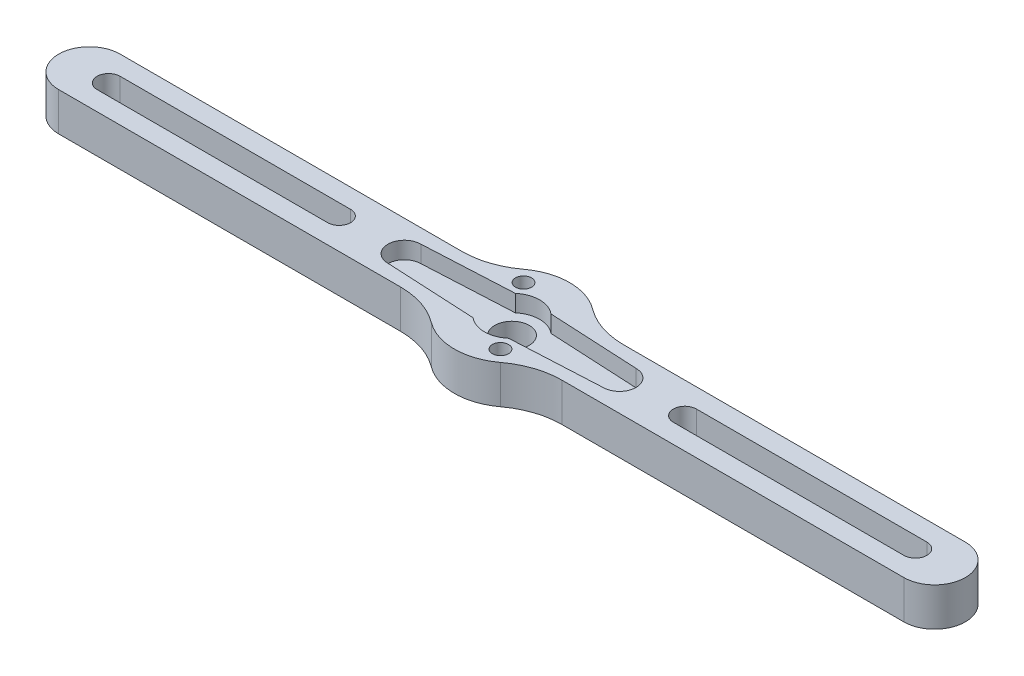
ISO-10303-21;
HEADER;
FILE_DESCRIPTION(('STEP AP214'),'2;1');
FILE_NAME('part.step','',(''),(''),'','','');
FILE_SCHEMA(('AUTOMOTIVE_DESIGN { 1 0 10303 214 1 1 1 1 }'));
ENDSEC;
DATA;
#1=APPLICATION_CONTEXT('core data for automotive mechanical design processes');
#2=APPLICATION_PROTOCOL_DEFINITION('international standard','automotive_design',2000,#1);
#3=PRODUCT_CONTEXT('',#1,'mechanical');
#4=PRODUCT('Part','Part','',(#3));
#5=PRODUCT_RELATED_PRODUCT_CATEGORY('part','',(#4));
#6=PRODUCT_DEFINITION_FORMATION('','',#4);
#7=PRODUCT_DEFINITION_CONTEXT('part definition',#1,'design');
#8=PRODUCT_DEFINITION('design','',#6,#7);
#9=PRODUCT_DEFINITION_SHAPE('','',#8);
#10=(LENGTH_UNIT() NAMED_UNIT(*) SI_UNIT(.MILLI.,.METRE.));
#11=(NAMED_UNIT(*) PLANE_ANGLE_UNIT() SI_UNIT($,.RADIAN.));
#12=(NAMED_UNIT(*) SI_UNIT($,.STERADIAN.) SOLID_ANGLE_UNIT());
#13=UNCERTAINTY_MEASURE_WITH_UNIT(LENGTH_MEASURE(1.E-05),#10,'distance_accuracy_value','');
#14=(GEOMETRIC_REPRESENTATION_CONTEXT(3) GLOBAL_UNCERTAINTY_ASSIGNED_CONTEXT((#13)) GLOBAL_UNIT_ASSIGNED_CONTEXT((#10,
#11,#12)) REPRESENTATION_CONTEXT('',''));
#15=CARTESIAN_POINT('',(0.,0.,0.));
#16=DIRECTION('',(0.,0.,1.));
#17=DIRECTION('',(1.,0.,0.));
#18=AXIS2_PLACEMENT_3D('',#15,#16,#17);
#19=CARTESIAN_POINT('',(0.,5.,0.));
#20=DIRECTION('',(0.,-1.,0.));
#21=DIRECTION('',(0.,0.,-1.));
#22=AXIS2_PLACEMENT_3D('',#19,#20,#21);
#23=CYLINDRICAL_SURFACE('',#22,2.25);
#24=CARTESIAN_POINT('',(0.,0.,0.));
#25=DIRECTION('',(0.,1.,0.));
#26=DIRECTION('',(0.,0.,1.));
#27=AXIS2_PLACEMENT_3D('',#24,#25,#26);
#28=CIRCLE('',#27,2.25);
#29=CARTESIAN_POINT('',(0.,0.,2.25));
#30=VERTEX_POINT('',#29);
#31=EDGE_CURVE('E358',#30,#30,#28,.T.);
#32=ORIENTED_EDGE('',*,*,#31,.F.);
#33=EDGE_LOOP('',(#32));
#34=FACE_BOUND('',#33,.T.);
#35=CARTESIAN_POINT('',(0.,2.8,0.));
#36=DIRECTION('',(0.,1.,0.));
#37=DIRECTION('',(0.,0.,1.));
#38=AXIS2_PLACEMENT_3D('',#35,#36,#37);
#39=CIRCLE('',#38,2.25);
#40=CARTESIAN_POINT('',(0.,2.8,2.25));
#41=VERTEX_POINT('',#40);
#42=EDGE_CURVE('E283',#41,#41,#39,.T.);
#43=ORIENTED_EDGE('',*,*,#42,.T.);
#44=EDGE_LOOP('',(#43));
#45=FACE_BOUND('',#44,.T.);
#46=ADVANCED_FACE('F37',(#34,#45),#23,.F.);
#47=CARTESIAN_POINT('',(0.,5.,-1.50000000000001));
#48=DIRECTION('',(0.,0.,-1.));
#49=DIRECTION('',(-1.,0.,0.));
#50=AXIS2_PLACEMENT_3D('',#47,#48,#49);
#51=PLANE('',#50);
#52=DIRECTION('',(1.,0.,0.));
#53=VECTOR('',#52,1.);
#54=CARTESIAN_POINT('',(0.,0.,-1.50000000000001));
#55=LINE('',#54,#53);
#56=CARTESIAN_POINT('',(22.5,0.,-1.50000000000001));
#57=VERTEX_POINT('',#56);
#58=CARTESIAN_POINT('',(52.5,0.,-1.50000000000001));
#59=VERTEX_POINT('',#58);
#60=EDGE_CURVE('E389',#57,#59,#55,.T.);
#61=ORIENTED_EDGE('',*,*,#60,.T.);
#62=DIRECTION('',(0.,-1.,0.));
#63=VECTOR('',#62,1.);
#64=CARTESIAN_POINT('',(52.5,5.,-1.50000000000001));
#65=LINE('',#64,#63);
#66=CARTESIAN_POINT('',(52.5,5.,-1.50000000000001));
#67=VERTEX_POINT('',#66);
#68=EDGE_CURVE('E407',#67,#59,#65,.T.);
#69=ORIENTED_EDGE('',*,*,#68,.F.);
#70=DIRECTION('',(1.,0.,0.));
#71=VECTOR('',#70,1.);
#72=CARTESIAN_POINT('',(0.,5.,-1.50000000000001));
#73=LINE('',#72,#71);
#74=CARTESIAN_POINT('',(22.5,5.,-1.50000000000001));
#75=VERTEX_POINT('',#74);
#76=EDGE_CURVE('E335',#75,#67,#73,.T.);
#77=ORIENTED_EDGE('',*,*,#76,.F.);
#78=DIRECTION('',(0.,-1.,0.));
#79=VECTOR('',#78,1.);
#80=CARTESIAN_POINT('',(22.5,5.,-1.50000000000001));
#81=LINE('',#80,#79);
#82=EDGE_CURVE('E399',#75,#57,#81,.T.);
#83=ORIENTED_EDGE('',*,*,#82,.T.);
#84=EDGE_LOOP('',(#61,#69,#77,#83));
#85=FACE_BOUND('',#84,.T.);
#86=ADVANCED_FACE('F517',(#85),#51,.F.);
#87=CARTESIAN_POINT('',(52.5,5.,0.));
#88=DIRECTION('',(0.,-1.,0.));
#89=DIRECTION('',(0.,0.,-1.));
#90=AXIS2_PLACEMENT_3D('',#87,#88,#89);
#91=CYLINDRICAL_SURFACE('',#90,1.50000000000001);
#92=CARTESIAN_POINT('',(52.5,0.,0.));
#93=DIRECTION('',(0.,1.,0.));
#94=DIRECTION('',(0.,0.,1.));
#95=AXIS2_PLACEMENT_3D('',#92,#93,#94);
#96=CIRCLE('',#95,1.50000000000001);
#97=CARTESIAN_POINT('',(52.5,0.,1.50000000000001));
#98=VERTEX_POINT('',#97);
#99=EDGE_CURVE('E392',#59,#98,#96,.F.);
#100=ORIENTED_EDGE('',*,*,#99,.T.);
#101=DIRECTION('',(0.,-1.,0.));
#102=VECTOR('',#101,1.);
#103=CARTESIAN_POINT('',(52.5,5.,1.50000000000001));
#104=LINE('',#103,#102);
#105=CARTESIAN_POINT('',(52.5,5.,1.50000000000001));
#106=VERTEX_POINT('',#105);
#107=EDGE_CURVE('E405',#106,#98,#104,.T.);
#108=ORIENTED_EDGE('',*,*,#107,.F.);
#109=CARTESIAN_POINT('',(52.5,5.,0.));
#110=DIRECTION('',(0.,1.,0.));
#111=DIRECTION('',(0.,0.,1.));
#112=AXIS2_PLACEMENT_3D('',#109,#110,#111);
#113=CIRCLE('',#112,1.50000000000001);
#114=EDGE_CURVE('E338',#67,#106,#113,.F.);
#115=ORIENTED_EDGE('',*,*,#114,.F.);
#116=ORIENTED_EDGE('',*,*,#68,.T.);
#117=EDGE_LOOP('',(#100,#108,#115,#116));
#118=FACE_BOUND('',#117,.T.);
#119=ADVANCED_FACE('F523',(#118),#91,.F.);
#120=CARTESIAN_POINT('',(0.,5.,1.50000000000001));
#121=DIRECTION('',(0.,0.,-1.));
#122=DIRECTION('',(-1.,0.,0.));
#123=AXIS2_PLACEMENT_3D('',#120,#121,#122);
#124=PLANE('',#123);
#125=DIRECTION('',(1.,0.,0.));
#126=VECTOR('',#125,1.);
#127=CARTESIAN_POINT('',(0.,0.,1.50000000000001));
#128=LINE('',#127,#126);
#129=CARTESIAN_POINT('',(22.5,0.,1.50000000000001));
#130=VERTEX_POINT('',#129);
#131=EDGE_CURVE('E395',#130,#98,#128,.T.);
#132=ORIENTED_EDGE('',*,*,#131,.F.);
#133=DIRECTION('',(0.,-1.,0.));
#134=VECTOR('',#133,1.);
#135=CARTESIAN_POINT('',(22.5,5.,1.50000000000001));
#136=LINE('',#135,#134);
#137=CARTESIAN_POINT('',(22.5,5.,1.50000000000001));
#138=VERTEX_POINT('',#137);
#139=EDGE_CURVE('E402',#138,#130,#136,.T.);
#140=ORIENTED_EDGE('',*,*,#139,.F.);
#141=DIRECTION('',(1.,0.,0.));
#142=VECTOR('',#141,1.);
#143=CARTESIAN_POINT('',(0.,5.,1.50000000000001));
#144=LINE('',#143,#142);
#145=EDGE_CURVE('E340',#138,#106,#144,.T.);
#146=ORIENTED_EDGE('',*,*,#145,.T.);
#147=ORIENTED_EDGE('',*,*,#107,.T.);
#148=EDGE_LOOP('',(#132,#140,#146,#147));
#149=FACE_BOUND('',#148,.T.);
#150=ADVANCED_FACE('F596',(#149),#124,.T.);
#151=CARTESIAN_POINT('',(55.,5.,0.));
#152=DIRECTION('',(0.,-1.,0.));
#153=DIRECTION('',(0.,0.,-1.));
#154=AXIS2_PLACEMENT_3D('',#151,#152,#153);
#155=CYLINDRICAL_SURFACE('',#154,3.99999999999998);
#156=CARTESIAN_POINT('',(55.,0.,0.));
#157=DIRECTION('',(0.,1.,0.));
#158=DIRECTION('',(0.,0.,1.));
#159=AXIS2_PLACEMENT_3D('',#156,#157,#158);
#160=CIRCLE('',#159,3.99999999999998);
#161=CARTESIAN_POINT('',(55.,0.,-3.99999999999998));
#162=VERTEX_POINT('',#161);
#163=CARTESIAN_POINT('',(55.,0.,3.99999999999998));
#164=VERTEX_POINT('',#163);
#165=EDGE_CURVE('E367',#162,#164,#160,.F.);
#166=ORIENTED_EDGE('',*,*,#165,.F.);
#167=DIRECTION('',(0.,-1.,0.));
#168=VECTOR('',#167,1.);
#169=CARTESIAN_POINT('',(55.,5.,-3.99999999999998));
#170=LINE('',#169,#168);
#171=CARTESIAN_POINT('',(55.,5.,-3.99999999999998));
#172=VERTEX_POINT('',#171);
#173=EDGE_CURVE('E403',#172,#162,#170,.T.);
#174=ORIENTED_EDGE('',*,*,#173,.F.);
#175=CARTESIAN_POINT('',(55.,5.,0.));
#176=DIRECTION('',(0.,1.,0.));
#177=DIRECTION('',(0.,0.,1.));
#178=AXIS2_PLACEMENT_3D('',#175,#176,#177);
#179=CIRCLE('',#178,3.99999999999998);
#180=CARTESIAN_POINT('',(55.,5.,3.99999999999998));
#181=VERTEX_POINT('',#180);
#182=EDGE_CURVE('E313',#172,#181,#179,.F.);
#183=ORIENTED_EDGE('',*,*,#182,.T.);
#184=DIRECTION('',(0.,-1.,0.));
#185=VECTOR('',#184,1.);
#186=CARTESIAN_POINT('',(55.,5.,3.99999999999998));
#187=LINE('',#186,#185);
#188=EDGE_CURVE('E411',#181,#164,#187,.T.);
#189=ORIENTED_EDGE('',*,*,#188,.T.);
#190=EDGE_LOOP('',(#166,#174,#183,#189));
#191=FACE_BOUND('',#190,.T.);
#192=ADVANCED_FACE('F503',(#191),#155,.T.);
#193=CARTESIAN_POINT('',(0.,5.,-4.));
#194=DIRECTION('',(0.,0.,-1.));
#195=DIRECTION('',(-1.,0.,0.));
#196=AXIS2_PLACEMENT_3D('',#193,#194,#195);
#197=PLANE('',#196);
#198=DIRECTION('',(1.,0.,0.));
#199=VECTOR('',#198,1.);
#200=CARTESIAN_POINT('',(0.,0.,-4.));
#201=LINE('',#200,#199);
#202=CARTESIAN_POINT('',(10.5,0.,-4.));
#203=VERTEX_POINT('',#202);
#204=EDGE_CURVE('E370',#203,#162,#201,.T.);
#205=ORIENTED_EDGE('',*,*,#204,.F.);
#206=DIRECTION('',(0.,1.,0.));
#207=VECTOR('',#206,1.);
#208=CARTESIAN_POINT('',(10.5,5.,-4.));
#209=LINE('',#208,#207);
#210=CARTESIAN_POINT('',(10.5,5.,-4.));
#211=VERTEX_POINT('',#210);
#212=EDGE_CURVE('E444',#203,#211,#209,.T.);
#213=ORIENTED_EDGE('',*,*,#212,.T.);
#214=DIRECTION('',(1.,0.,0.));
#215=VECTOR('',#214,1.);
#216=CARTESIAN_POINT('',(0.,5.,-4.));
#217=LINE('',#216,#215);
#218=EDGE_CURVE('E316',#211,#172,#217,.T.);
#219=ORIENTED_EDGE('',*,*,#218,.T.);
#220=ORIENTED_EDGE('',*,*,#173,.T.);
#221=EDGE_LOOP('',(#205,#213,#219,#220));
#222=FACE_BOUND('',#221,.T.);
#223=ADVANCED_FACE('F506',(#222),#197,.T.);
#224=CARTESIAN_POINT('',(0.,5.,0.));
#225=DIRECTION('',(0.,-1.,0.));
#226=DIRECTION('',(0.,0.,-1.));
#227=AXIS2_PLACEMENT_3D('',#224,#225,#226);
#228=CYLINDRICAL_SURFACE('',#227,7.5);
#229=CARTESIAN_POINT('',(0.,5.,0.));
#230=DIRECTION('',(0.,1.,0.));
#231=DIRECTION('',(0.,0.,1.));
#232=AXIS2_PLACEMENT_3D('',#229,#230,#231);
#233=CIRCLE('',#232,7.5);
#234=CARTESIAN_POINT('',(-4.5,5.,-6.));
#235=VERTEX_POINT('',#234);
#236=CARTESIAN_POINT('',(4.5,5.,-6.));
#237=VERTEX_POINT('',#236);
#238=EDGE_CURVE('E318',#235,#237,#233,.F.);
#239=ORIENTED_EDGE('',*,*,#238,.T.);
#240=DIRECTION('',(0.,-1.,0.));
#241=VECTOR('',#240,1.);
#242=CARTESIAN_POINT('',(4.5,5.,-6.));
#243=LINE('',#242,#241);
#244=CARTESIAN_POINT('',(4.5,0.,-6.));
#245=VERTEX_POINT('',#244);
#246=EDGE_CURVE('E441',#237,#245,#243,.T.);
#247=ORIENTED_EDGE('',*,*,#246,.T.);
#248=CARTESIAN_POINT('',(0.,0.,0.));
#249=DIRECTION('',(0.,1.,0.));
#250=DIRECTION('',(0.,0.,1.));
#251=AXIS2_PLACEMENT_3D('',#248,#249,#250);
#252=CIRCLE('',#251,7.5);
#253=CARTESIAN_POINT('',(-4.5,0.,-6.));
#254=VERTEX_POINT('',#253);
#255=EDGE_CURVE('E372',#254,#245,#252,.F.);
#256=ORIENTED_EDGE('',*,*,#255,.F.);
#257=DIRECTION('',(0.,-1.,0.));
#258=VECTOR('',#257,1.);
#259=CARTESIAN_POINT('',(-4.5,5.,-6.));
#260=LINE('',#259,#258);
#261=EDGE_CURVE('E439',#254,#235,#260,.F.);
#262=ORIENTED_EDGE('',*,*,#261,.T.);
#263=EDGE_LOOP('',(#239,#247,#256,#262));
#264=FACE_BOUND('',#263,.T.);
#265=ADVANCED_FACE('F466',(#264),#228,.T.);
#266=CARTESIAN_POINT('',(0.,5.,-4.));
#267=DIRECTION('',(0.,0.,1.));
#268=DIRECTION('',(1.,0.,0.));
#269=AXIS2_PLACEMENT_3D('',#266,#267,#268);
#270=PLANE('',#269);
#271=DIRECTION('',(-1.,0.,0.));
#272=VECTOR('',#271,1.);
#273=CARTESIAN_POINT('',(0.,5.,-4.));
#274=LINE('',#273,#272);
#275=CARTESIAN_POINT('',(-10.5,5.,-4.));
#276=VERTEX_POINT('',#275);
#277=CARTESIAN_POINT('',(-55.,5.,-3.99999999999999));
#278=VERTEX_POINT('',#277);
#279=EDGE_CURVE('E321',#276,#278,#274,.T.);
#280=ORIENTED_EDGE('',*,*,#279,.F.);
#281=DIRECTION('',(0.,-1.,0.));
#282=VECTOR('',#281,1.);
#283=CARTESIAN_POINT('',(-10.5,5.,-4.));
#284=LINE('',#283,#282);
#285=CARTESIAN_POINT('',(-10.5,0.,-4.));
#286=VERTEX_POINT('',#285);
#287=EDGE_CURVE('E446',#276,#286,#284,.T.);
#288=ORIENTED_EDGE('',*,*,#287,.T.);
#289=DIRECTION('',(-1.,0.,0.));
#290=VECTOR('',#289,1.);
#291=CARTESIAN_POINT('',(0.,0.,-4.));
#292=LINE('',#291,#290);
#293=CARTESIAN_POINT('',(-55.,0.,-3.99999999999999));
#294=VERTEX_POINT('',#293);
#295=EDGE_CURVE('E375',#286,#294,#292,.T.);
#296=ORIENTED_EDGE('',*,*,#295,.T.);
#297=DIRECTION('',(0.,-1.,0.));
#298=VECTOR('',#297,1.);
#299=CARTESIAN_POINT('',(-55.,5.,-3.99999999999999));
#300=LINE('',#299,#298);
#301=EDGE_CURVE('E417',#278,#294,#300,.T.);
#302=ORIENTED_EDGE('',*,*,#301,.F.);
#303=EDGE_LOOP('',(#280,#288,#296,#302));
#304=FACE_BOUND('',#303,.T.);
#305=ADVANCED_FACE('F469',(#304),#270,.F.);
#306=CARTESIAN_POINT('',(-55.,5.,0.));
#307=DIRECTION('',(0.,-1.,0.));
#308=DIRECTION('',(0.,0.,-1.));
#309=AXIS2_PLACEMENT_3D('',#306,#307,#308);
#310=CYLINDRICAL_SURFACE('',#309,3.99999999999999);
#311=CARTESIAN_POINT('',(-55.,0.,0.));
#312=DIRECTION('',(0.,1.,0.));
#313=DIRECTION('',(0.,0.,1.));
#314=AXIS2_PLACEMENT_3D('',#311,#312,#313);
#315=CIRCLE('',#314,3.99999999999999);
#316=CARTESIAN_POINT('',(-55.,0.,3.99999999999999));
#317=VERTEX_POINT('',#316);
#318=EDGE_CURVE('E377',#294,#317,#315,.T.);
#319=ORIENTED_EDGE('',*,*,#318,.T.);
#320=DIRECTION('',(0.,-1.,0.));
#321=VECTOR('',#320,1.);
#322=CARTESIAN_POINT('',(-55.,5.,3.99999999999999));
#323=LINE('',#322,#321);
#324=CARTESIAN_POINT('',(-55.,5.,3.99999999999999));
#325=VERTEX_POINT('',#324);
#326=EDGE_CURVE('E413',#325,#317,#323,.T.);
#327=ORIENTED_EDGE('',*,*,#326,.F.);
#328=CARTESIAN_POINT('',(-55.,5.,0.));
#329=DIRECTION('',(0.,1.,0.));
#330=DIRECTION('',(0.,0.,1.));
#331=AXIS2_PLACEMENT_3D('',#328,#329,#330);
#332=CIRCLE('',#331,3.99999999999999);
#333=EDGE_CURVE('E323',#278,#325,#332,.T.);
#334=ORIENTED_EDGE('',*,*,#333,.F.);
#335=ORIENTED_EDGE('',*,*,#301,.T.);
#336=EDGE_LOOP('',(#319,#327,#334,#335));
#337=FACE_BOUND('',#336,.T.);
#338=ADVANCED_FACE('F477',(#337),#310,.T.);
#339=CARTESIAN_POINT('',(0.,5.,4.));
#340=DIRECTION('',(0.,0.,-1.));
#341=DIRECTION('',(-1.,0.,0.));
#342=AXIS2_PLACEMENT_3D('',#339,#340,#341);
#343=PLANE('',#342);
#344=DIRECTION('',(1.,0.,0.));
#345=VECTOR('',#344,1.);
#346=CARTESIAN_POINT('',(0.,0.,4.));
#347=LINE('',#346,#345);
#348=CARTESIAN_POINT('',(-10.5,0.,4.));
#349=VERTEX_POINT('',#348);
#350=EDGE_CURVE('E380',#317,#349,#347,.T.);
#351=ORIENTED_EDGE('',*,*,#350,.T.);
#352=DIRECTION('',(0.,1.,0.));
#353=VECTOR('',#352,1.);
#354=CARTESIAN_POINT('',(-10.5,5.,4.));
#355=LINE('',#354,#353);
#356=CARTESIAN_POINT('',(-10.5,5.,4.));
#357=VERTEX_POINT('',#356);
#358=EDGE_CURVE('E437',#349,#357,#355,.T.);
#359=ORIENTED_EDGE('',*,*,#358,.T.);
#360=DIRECTION('',(1.,0.,0.));
#361=VECTOR('',#360,1.);
#362=CARTESIAN_POINT('',(0.,5.,4.));
#363=LINE('',#362,#361);
#364=EDGE_CURVE('E326',#325,#357,#363,.T.);
#365=ORIENTED_EDGE('',*,*,#364,.F.);
#366=ORIENTED_EDGE('',*,*,#326,.T.);
#367=EDGE_LOOP('',(#351,#359,#365,#366));
#368=FACE_BOUND('',#367,.T.);
#369=ADVANCED_FACE('F479',(#368),#343,.F.);
#370=CARTESIAN_POINT('',(0.,5.,0.));
#371=DIRECTION('',(0.,-1.,0.));
#372=DIRECTION('',(0.,0.,-1.));
#373=AXIS2_PLACEMENT_3D('',#370,#371,#372);
#374=CYLINDRICAL_SURFACE('',#373,7.5);
#375=CARTESIAN_POINT('',(0.,0.,0.));
#376=DIRECTION('',(0.,1.,0.));
#377=DIRECTION('',(0.,0.,1.));
#378=AXIS2_PLACEMENT_3D('',#375,#376,#377);
#379=CIRCLE('',#378,7.5);
#380=CARTESIAN_POINT('',(-4.5,0.,6.));
#381=VERTEX_POINT('',#380);
#382=CARTESIAN_POINT('',(4.5,0.,6.));
#383=VERTEX_POINT('',#382);
#384=EDGE_CURVE('E383',#381,#383,#379,.T.);
#385=ORIENTED_EDGE('',*,*,#384,.T.);
#386=DIRECTION('',(0.,-1.,0.));
#387=VECTOR('',#386,1.);
#388=CARTESIAN_POINT('',(4.5,5.,6.));
#389=LINE('',#388,#387);
#390=CARTESIAN_POINT('',(4.5,5.,6.));
#391=VERTEX_POINT('',#390);
#392=EDGE_CURVE('E435',#383,#391,#389,.F.);
#393=ORIENTED_EDGE('',*,*,#392,.T.);
#394=CARTESIAN_POINT('',(0.,5.,0.));
#395=DIRECTION('',(0.,1.,0.));
#396=DIRECTION('',(0.,0.,1.));
#397=AXIS2_PLACEMENT_3D('',#394,#395,#396);
#398=CIRCLE('',#397,7.5);
#399=CARTESIAN_POINT('',(-4.5,5.,6.));
#400=VERTEX_POINT('',#399);
#401=EDGE_CURVE('E329',#400,#391,#398,.T.);
#402=ORIENTED_EDGE('',*,*,#401,.F.);
#403=DIRECTION('',(0.,-1.,0.));
#404=VECTOR('',#403,1.);
#405=CARTESIAN_POINT('',(-4.5,5.,6.));
#406=LINE('',#405,#404);
#407=EDGE_CURVE('E432',#400,#381,#406,.T.);
#408=ORIENTED_EDGE('',*,*,#407,.T.);
#409=EDGE_LOOP('',(#385,#393,#402,#408));
#410=FACE_BOUND('',#409,.T.);
#411=ADVANCED_FACE('F488',(#410),#374,.T.);
#412=CARTESIAN_POINT('',(-52.5,5.,0.));
#413=DIRECTION('',(0.,-1.,0.));
#414=DIRECTION('',(0.,0.,-1.));
#415=AXIS2_PLACEMENT_3D('',#412,#413,#414);
#416=CYLINDRICAL_SURFACE('',#415,1.50000000000001);
#417=CARTESIAN_POINT('',(-52.5,0.,0.));
#418=DIRECTION('',(0.,1.,0.));
#419=DIRECTION('',(0.,0.,1.));
#420=AXIS2_PLACEMENT_3D('',#417,#418,#419);
#421=CIRCLE('',#420,1.50000000000001);
#422=CARTESIAN_POINT('',(-52.5,0.,-1.5));
#423=VERTEX_POINT('',#422);
#424=CARTESIAN_POINT('',(-52.5,0.,1.50000000000002));
#425=VERTEX_POINT('',#424);
#426=EDGE_CURVE('E346',#423,#425,#421,.T.);
#427=ORIENTED_EDGE('',*,*,#426,.F.);
#428=DIRECTION('',(0.,-1.,0.));
#429=VECTOR('',#428,1.);
#430=CARTESIAN_POINT('',(-52.5,5.,-1.5));
#431=LINE('',#430,#429);
#432=CARTESIAN_POINT('',(-52.5,5.,-1.5));
#433=VERTEX_POINT('',#432);
#434=EDGE_CURVE('E414',#433,#423,#431,.T.);
#435=ORIENTED_EDGE('',*,*,#434,.F.);
#436=CARTESIAN_POINT('',(-52.5,5.,0.));
#437=DIRECTION('',(0.,1.,0.));
#438=DIRECTION('',(0.,0.,1.));
#439=AXIS2_PLACEMENT_3D('',#436,#437,#438);
#440=CIRCLE('',#439,1.50000000000001);
#441=CARTESIAN_POINT('',(-52.5,5.,1.50000000000002));
#442=VERTEX_POINT('',#441);
#443=EDGE_CURVE('E295',#433,#442,#440,.T.);
#444=ORIENTED_EDGE('',*,*,#443,.T.);
#445=DIRECTION('',(0.,-1.,0.));
#446=VECTOR('',#445,1.);
#447=CARTESIAN_POINT('',(-52.5,5.,1.50000000000002));
#448=LINE('',#447,#446);
#449=EDGE_CURVE('E345',#442,#425,#448,.T.);
#450=ORIENTED_EDGE('',*,*,#449,.T.);
#451=EDGE_LOOP('',(#427,#435,#444,#450));
#452=FACE_BOUND('',#451,.T.);
#453=ADVANCED_FACE('F544',(#452),#416,.F.);
#454=CARTESIAN_POINT('',(0.,5.,-1.50000000000001));
#455=DIRECTION('',(0.,0.,1.));
#456=DIRECTION('',(1.,0.,0.));
#457=AXIS2_PLACEMENT_3D('',#454,#455,#456);
#458=PLANE('',#457);
#459=DIRECTION('',(-1.,0.,0.));
#460=VECTOR('',#459,1.);
#461=CARTESIAN_POINT('',(0.,0.,-1.50000000000001));
#462=LINE('',#461,#460);
#463=CARTESIAN_POINT('',(-22.5,0.,-1.50000000000001));
#464=VERTEX_POINT('',#463);
#465=EDGE_CURVE('E349',#464,#423,#462,.T.);
#466=ORIENTED_EDGE('',*,*,#465,.F.);
#467=DIRECTION('',(0.,-1.,0.));
#468=VECTOR('',#467,1.);
#469=CARTESIAN_POINT('',(-22.5,5.,-1.50000000000001));
#470=LINE('',#469,#468);
#471=CARTESIAN_POINT('',(-22.5,5.,-1.50000000000001));
#472=VERTEX_POINT('',#471);
#473=EDGE_CURVE('E425',#472,#464,#470,.T.);
#474=ORIENTED_EDGE('',*,*,#473,.F.);
#475=DIRECTION('',(-1.,0.,0.));
#476=VECTOR('',#475,1.);
#477=CARTESIAN_POINT('',(0.,5.,-1.50000000000001));
#478=LINE('',#477,#476);
#479=EDGE_CURVE('E298',#472,#433,#478,.T.);
#480=ORIENTED_EDGE('',*,*,#479,.T.);
#481=ORIENTED_EDGE('',*,*,#434,.T.);
#482=EDGE_LOOP('',(#466,#474,#480,#481));
#483=FACE_BOUND('',#482,.T.);
#484=ADVANCED_FACE('F540',(#483),#458,.T.);
#485=CARTESIAN_POINT('',(-22.5,5.,0.));
#486=DIRECTION('',(0.,-1.,0.));
#487=DIRECTION('',(0.,0.,-1.));
#488=AXIS2_PLACEMENT_3D('',#485,#486,#487);
#489=CYLINDRICAL_SURFACE('',#488,1.50000000000001);
#490=CARTESIAN_POINT('',(-22.5,0.,0.));
#491=DIRECTION('',(0.,1.,0.));
#492=DIRECTION('',(0.,0.,1.));
#493=AXIS2_PLACEMENT_3D('',#490,#491,#492);
#494=CIRCLE('',#493,1.50000000000001);
#495=CARTESIAN_POINT('',(-22.5,0.,1.50000000000002));
#496=VERTEX_POINT('',#495);
#497=EDGE_CURVE('E352',#496,#464,#494,.T.);
#498=ORIENTED_EDGE('',*,*,#497,.F.);
#499=DIRECTION('',(0.,-1.,0.));
#500=VECTOR('',#499,1.);
#501=CARTESIAN_POINT('',(-22.5,5.,1.50000000000002));
#502=LINE('',#501,#500);
#503=CARTESIAN_POINT('',(-22.5,5.,1.50000000000002));
#504=VERTEX_POINT('',#503);
#505=EDGE_CURVE('E423',#504,#496,#502,.T.);
#506=ORIENTED_EDGE('',*,*,#505,.F.);
#507=CARTESIAN_POINT('',(-22.5,5.,0.));
#508=DIRECTION('',(0.,1.,0.));
#509=DIRECTION('',(0.,0.,1.));
#510=AXIS2_PLACEMENT_3D('',#507,#508,#509);
#511=CIRCLE('',#510,1.50000000000001);
#512=EDGE_CURVE('E302',#504,#472,#511,.T.);
#513=ORIENTED_EDGE('',*,*,#512,.T.);
#514=ORIENTED_EDGE('',*,*,#473,.T.);
#515=EDGE_LOOP('',(#498,#506,#513,#514));
#516=FACE_BOUND('',#515,.T.);
#517=ADVANCED_FACE('F537',(#516),#489,.F.);
#518=CARTESIAN_POINT('',(0.,5.,4.));
#519=DIRECTION('',(0.,0.,1.));
#520=DIRECTION('',(1.,0.,0.));
#521=AXIS2_PLACEMENT_3D('',#518,#519,#520);
#522=PLANE('',#521);
#523=DIRECTION('',(-1.,0.,0.));
#524=VECTOR('',#523,1.);
#525=CARTESIAN_POINT('',(0.,5.,4.));
#526=LINE('',#525,#524);
#527=CARTESIAN_POINT('',(10.5,5.,4.));
#528=VERTEX_POINT('',#527);
#529=EDGE_CURVE('E332',#181,#528,#526,.T.);
#530=ORIENTED_EDGE('',*,*,#529,.T.);
#531=DIRECTION('',(0.,-1.,0.));
#532=VECTOR('',#531,1.);
#533=CARTESIAN_POINT('',(10.5,5.,4.));
#534=LINE('',#533,#532);
#535=CARTESIAN_POINT('',(10.5,0.,4.));
#536=VERTEX_POINT('',#535);
#537=EDGE_CURVE('E410',#528,#536,#534,.T.);
#538=ORIENTED_EDGE('',*,*,#537,.T.);
#539=DIRECTION('',(-1.,0.,0.));
#540=VECTOR('',#539,1.);
#541=CARTESIAN_POINT('',(0.,0.,4.));
#542=LINE('',#541,#540);
#543=EDGE_CURVE('E386',#164,#536,#542,.T.);
#544=ORIENTED_EDGE('',*,*,#543,.F.);
#545=ORIENTED_EDGE('',*,*,#188,.F.);
#546=EDGE_LOOP('',(#530,#538,#544,#545));
#547=FACE_BOUND('',#546,.T.);
#548=ADVANCED_FACE('F496',(#547),#522,.T.);
#549=CARTESIAN_POINT('',(-3.,5.,-4.5));
#550=DIRECTION('',(0.,-1.,0.));
#551=DIRECTION('',(0.,0.,-1.));
#552=AXIS2_PLACEMENT_3D('',#549,#550,#551);
#553=CYLINDRICAL_SURFACE('',#552,1.05);
#554=CARTESIAN_POINT('',(-3.,5.,-4.5));
#555=DIRECTION('',(0.,1.,0.));
#556=DIRECTION('',(0.,0.,1.));
#557=AXIS2_PLACEMENT_3D('',#554,#555,#556);
#558=CIRCLE('',#557,1.05);
#559=CARTESIAN_POINT('',(-3.,5.,-3.45));
#560=VERTEX_POINT('',#559);
#561=EDGE_CURVE('E310',#560,#560,#558,.T.);
#562=ORIENTED_EDGE('',*,*,#561,.T.);
#563=EDGE_LOOP('',(#562));
#564=FACE_BOUND('',#563,.T.);
#565=CARTESIAN_POINT('',(-3.,0.,-4.5));
#566=DIRECTION('',(0.,1.,0.));
#567=DIRECTION('',(0.,0.,1.));
#568=AXIS2_PLACEMENT_3D('',#565,#566,#567);
#569=CIRCLE('',#568,1.05);
#570=CARTESIAN_POINT('',(-3.,0.,-3.45));
#571=VERTEX_POINT('',#570);
#572=EDGE_CURVE('E364',#571,#571,#569,.T.);
#573=ORIENTED_EDGE('',*,*,#572,.F.);
#574=EDGE_LOOP('',(#573));
#575=FACE_BOUND('',#574,.T.);
#576=ADVANCED_FACE('F605',(#564,#575),#553,.F.);
#577=CARTESIAN_POINT('',(3.,5.,4.5));
#578=DIRECTION('',(0.,-1.,0.));
#579=DIRECTION('',(0.,0.,-1.));
#580=AXIS2_PLACEMENT_3D('',#577,#578,#579);
#581=CYLINDRICAL_SURFACE('',#580,1.05);
#582=CARTESIAN_POINT('',(3.,5.,4.5));
#583=DIRECTION('',(0.,1.,0.));
#584=DIRECTION('',(0.,0.,1.));
#585=AXIS2_PLACEMENT_3D('',#582,#583,#584);
#586=CIRCLE('',#585,1.05);
#587=CARTESIAN_POINT('',(3.,5.,5.55));
#588=VERTEX_POINT('',#587);
#589=EDGE_CURVE('E307',#588,#588,#586,.T.);
#590=ORIENTED_EDGE('',*,*,#589,.T.);
#591=EDGE_LOOP('',(#590));
#592=FACE_BOUND('',#591,.T.);
#593=CARTESIAN_POINT('',(3.,0.,4.5));
#594=DIRECTION('',(0.,1.,0.));
#595=DIRECTION('',(0.,0.,1.));
#596=AXIS2_PLACEMENT_3D('',#593,#594,#595);
#597=CIRCLE('',#596,1.05);
#598=CARTESIAN_POINT('',(3.,0.,5.55));
#599=VERTEX_POINT('',#598);
#600=EDGE_CURVE('E361',#599,#599,#597,.T.);
#601=ORIENTED_EDGE('',*,*,#600,.F.);
#602=EDGE_LOOP('',(#601));
#603=FACE_BOUND('',#602,.T.);
#604=ADVANCED_FACE('F530',(#592,#603),#581,.F.);
#605=CARTESIAN_POINT('',(0.,5.,1.50000000000001));
#606=DIRECTION('',(0.,0.,1.));
#607=DIRECTION('',(1.,0.,0.));
#608=AXIS2_PLACEMENT_3D('',#605,#606,#607);
#609=PLANE('',#608);
#610=DIRECTION('',(-1.,0.,0.));
#611=VECTOR('',#610,1.);
#612=CARTESIAN_POINT('',(0.,0.,1.50000000000001));
#613=LINE('',#612,#611);
#614=EDGE_CURVE('E355',#496,#425,#613,.T.);
#615=ORIENTED_EDGE('',*,*,#614,.T.);
#616=ORIENTED_EDGE('',*,*,#449,.F.);
#617=DIRECTION('',(-1.,0.,0.));
#618=VECTOR('',#617,1.);
#619=CARTESIAN_POINT('',(0.,5.,1.50000000000001));
#620=LINE('',#619,#618);
#621=EDGE_CURVE('E305',#504,#442,#620,.T.);
#622=ORIENTED_EDGE('',*,*,#621,.F.);
#623=ORIENTED_EDGE('',*,*,#505,.T.);
#624=EDGE_LOOP('',(#615,#616,#622,#623));
#625=FACE_BOUND('',#624,.T.);
#626=ADVANCED_FACE('F532',(#625),#609,.F.);
#627=CARTESIAN_POINT('',(22.5,5.,0.));
#628=DIRECTION('',(0.,-1.,0.));
#629=DIRECTION('',(0.,0.,-1.));
#630=AXIS2_PLACEMENT_3D('',#627,#628,#629);
#631=CYLINDRICAL_SURFACE('',#630,1.50000000000001);
#632=CARTESIAN_POINT('',(22.5,0.,0.));
#633=DIRECTION('',(0.,1.,0.));
#634=DIRECTION('',(0.,0.,1.));
#635=AXIS2_PLACEMENT_3D('',#632,#633,#634);
#636=CIRCLE('',#635,1.50000000000001);
#637=EDGE_CURVE('E299',#130,#57,#636,.F.);
#638=ORIENTED_EDGE('',*,*,#637,.T.);
#639=ORIENTED_EDGE('',*,*,#82,.F.);
#640=CARTESIAN_POINT('',(22.5,5.,0.));
#641=DIRECTION('',(0.,1.,0.));
#642=DIRECTION('',(0.,0.,1.));
#643=AXIS2_PLACEMENT_3D('',#640,#641,#642);
#644=CIRCLE('',#643,1.50000000000001);
#645=EDGE_CURVE('E343',#138,#75,#644,.F.);
#646=ORIENTED_EDGE('',*,*,#645,.F.);
#647=ORIENTED_EDGE('',*,*,#139,.T.);
#648=EDGE_LOOP('',(#638,#639,#646,#647));
#649=FACE_BOUND('',#648,.T.);
#650=ADVANCED_FACE('F535',(#649),#631,.F.);
#651=CARTESIAN_POINT('',(0.,5.,0.));
#652=DIRECTION('',(0.,1.,0.));
#653=DIRECTION('',(0.,0.,1.));
#654=AXIS2_PLACEMENT_3D('',#651,#652,#653);
#655=PLANE('',#654);
#656=DIRECTION('',(-0.998682442068856,0.,-0.0513164681499629));
#657=VECTOR('',#656,1.);
#658=CARTESIAN_POINT('',(14.,5.,-2.15));
#659=LINE('',#658,#657);
#660=CARTESIAN_POINT('',(14.,5.,-2.15));
#661=VERTEX_POINT('',#660);
#662=CARTESIAN_POINT('',(2.32325203109779,5.,-2.75));
#663=VERTEX_POINT('',#662);
#664=EDGE_CURVE('E227',#661,#663,#659,.T.);
#665=ORIENTED_EDGE('',*,*,#664,.F.);
#666=CARTESIAN_POINT('',(14.,5.,0.));
#667=DIRECTION('',(0.,-1.,0.));
#668=DIRECTION('',(0.,0.,-1.));
#669=AXIS2_PLACEMENT_3D('',#666,#667,#668);
#670=CIRCLE('',#669,2.15);
#671=CARTESIAN_POINT('',(14.,5.,2.15));
#672=VERTEX_POINT('',#671);
#673=EDGE_CURVE('E245',#661,#672,#670,.T.);
#674=ORIENTED_EDGE('',*,*,#673,.T.);
#675=DIRECTION('',(-0.998682442068856,0.,0.0513164681499627));
#676=VECTOR('',#675,1.);
#677=CARTESIAN_POINT('',(14.,5.,2.15));
#678=LINE('',#677,#676);
#679=CARTESIAN_POINT('',(2.32325203109779,5.,2.75));
#680=VERTEX_POINT('',#679);
#681=EDGE_CURVE('E248',#672,#680,#678,.T.);
#682=ORIENTED_EDGE('',*,*,#681,.T.);
#683=CARTESIAN_POINT('',(0.,5.,0.));
#684=DIRECTION('',(0.,1.,0.));
#685=DIRECTION('',(0.,0.,1.));
#686=AXIS2_PLACEMENT_3D('',#683,#684,#685);
#687=CIRCLE('',#686,3.6);
#688=CARTESIAN_POINT('',(-2.32325203109779,5.,2.75));
#689=VERTEX_POINT('',#688);
#690=EDGE_CURVE('E276',#689,#680,#687,.T.);
#691=ORIENTED_EDGE('',*,*,#690,.F.);
#692=DIRECTION('',(0.998682442068856,0.,0.0513164681499627));
#693=VECTOR('',#692,1.);
#694=CARTESIAN_POINT('',(-14.,5.,2.15));
#695=LINE('',#694,#693);
#696=CARTESIAN_POINT('',(-14.,5.,2.15));
#697=VERTEX_POINT('',#696);
#698=EDGE_CURVE('E273',#697,#689,#695,.T.);
#699=ORIENTED_EDGE('',*,*,#698,.F.);
#700=CARTESIAN_POINT('',(-14.,5.,0.));
#701=DIRECTION('',(0.,1.,0.));
#702=DIRECTION('',(0.,0.,1.));
#703=AXIS2_PLACEMENT_3D('',#700,#701,#702);
#704=CIRCLE('',#703,2.15);
#705=CARTESIAN_POINT('',(-14.,5.,-2.15));
#706=VERTEX_POINT('',#705);
#707=EDGE_CURVE('E270',#706,#697,#704,.T.);
#708=ORIENTED_EDGE('',*,*,#707,.F.);
#709=DIRECTION('',(0.998682442068856,0.,-0.0513164681499629));
#710=VECTOR('',#709,1.);
#711=CARTESIAN_POINT('',(-14.,5.,-2.15));
#712=LINE('',#711,#710);
#713=CARTESIAN_POINT('',(-2.32325203109779,5.,-2.75));
#714=VERTEX_POINT('',#713);
#715=EDGE_CURVE('E267',#706,#714,#712,.T.);
#716=ORIENTED_EDGE('',*,*,#715,.T.);
#717=CARTESIAN_POINT('',(0.,5.,0.));
#718=DIRECTION('',(0.,1.,0.));
#719=DIRECTION('',(0.,0.,1.));
#720=AXIS2_PLACEMENT_3D('',#717,#718,#719);
#721=CIRCLE('',#720,3.6);
#722=EDGE_CURVE('E265',#663,#714,#721,.T.);
#723=ORIENTED_EDGE('',*,*,#722,.F.);
#724=EDGE_LOOP('',(#665,#674,#682,#691,#699,#708,#716,#723));
#725=FACE_BOUND('',#724,.T.);
#726=ORIENTED_EDGE('',*,*,#443,.F.);
#727=ORIENTED_EDGE('',*,*,#479,.F.);
#728=ORIENTED_EDGE('',*,*,#512,.F.);
#729=ORIENTED_EDGE('',*,*,#621,.T.);
#730=EDGE_LOOP('',(#726,#727,#728,#729));
#731=FACE_BOUND('',#730,.T.);
#732=ORIENTED_EDGE('',*,*,#589,.F.);
#733=EDGE_LOOP('',(#732));
#734=FACE_BOUND('',#733,.T.);
#735=ORIENTED_EDGE('',*,*,#561,.F.);
#736=EDGE_LOOP('',(#735));
#737=FACE_BOUND('',#736,.T.);
#738=ORIENTED_EDGE('',*,*,#182,.F.);
#739=ORIENTED_EDGE('',*,*,#218,.F.);
#740=CARTESIAN_POINT('',(10.5,5.,-14.));
#741=DIRECTION('',(0.,1.,0.));
#742=DIRECTION('',(0.,0.,1.));
#743=AXIS2_PLACEMENT_3D('',#740,#741,#742);
#744=CIRCLE('',#743,10.);
#745=EDGE_CURVE('E458',#211,#237,#744,.F.);
#746=ORIENTED_EDGE('',*,*,#745,.T.);
#747=ORIENTED_EDGE('',*,*,#238,.F.);
#748=CARTESIAN_POINT('',(-10.5,5.,-14.));
#749=DIRECTION('',(0.,1.,0.));
#750=DIRECTION('',(0.,0.,1.));
#751=AXIS2_PLACEMENT_3D('',#748,#749,#750);
#752=CIRCLE('',#751,10.);
#753=EDGE_CURVE('E11',#235,#276,#752,.F.);
#754=ORIENTED_EDGE('',*,*,#753,.T.);
#755=ORIENTED_EDGE('',*,*,#279,.T.);
#756=ORIENTED_EDGE('',*,*,#333,.T.);
#757=ORIENTED_EDGE('',*,*,#364,.T.);
#758=CARTESIAN_POINT('',(-10.5,5.,14.));
#759=DIRECTION('',(0.,1.,0.));
#760=DIRECTION('',(0.,0.,1.));
#761=AXIS2_PLACEMENT_3D('',#758,#759,#760);
#762=CIRCLE('',#761,10.);
#763=EDGE_CURVE('E454',#357,#400,#762,.F.);
#764=ORIENTED_EDGE('',*,*,#763,.T.);
#765=ORIENTED_EDGE('',*,*,#401,.T.);
#766=CARTESIAN_POINT('',(10.5,5.,14.));
#767=DIRECTION('',(0.,1.,0.));
#768=DIRECTION('',(0.,0.,1.));
#769=AXIS2_PLACEMENT_3D('',#766,#767,#768);
#770=CIRCLE('',#769,10.);
#771=EDGE_CURVE('E450',#391,#528,#770,.F.);
#772=ORIENTED_EDGE('',*,*,#771,.T.);
#773=ORIENTED_EDGE('',*,*,#529,.F.);
#774=EDGE_LOOP('',(#738,#739,#746,#747,#754,#755,#756,#757,#764,#765,#772,#773));
#775=FACE_BOUND('',#774,.T.);
#776=ORIENTED_EDGE('',*,*,#76,.T.);
#777=ORIENTED_EDGE('',*,*,#114,.T.);
#778=ORIENTED_EDGE('',*,*,#145,.F.);
#779=ORIENTED_EDGE('',*,*,#645,.T.);
#780=EDGE_LOOP('',(#776,#777,#778,#779));
#781=FACE_BOUND('',#780,.T.);
#782=ADVANCED_FACE('F473',(#725,#731,#734,#737,#775,#781),#655,.T.);
#783=CARTESIAN_POINT('',(0.,0.,0.));
#784=DIRECTION('',(0.,1.,0.));
#785=DIRECTION('',(0.,0.,1.));
#786=AXIS2_PLACEMENT_3D('',#783,#784,#785);
#787=PLANE('',#786);
#788=ORIENTED_EDGE('',*,*,#426,.T.);
#789=ORIENTED_EDGE('',*,*,#614,.F.);
#790=ORIENTED_EDGE('',*,*,#497,.T.);
#791=ORIENTED_EDGE('',*,*,#465,.T.);
#792=EDGE_LOOP('',(#788,#789,#790,#791));
#793=FACE_BOUND('',#792,.T.);
#794=ORIENTED_EDGE('',*,*,#31,.T.);
#795=EDGE_LOOP('',(#794));
#796=FACE_BOUND('',#795,.T.);
#797=ORIENTED_EDGE('',*,*,#600,.T.);
#798=EDGE_LOOP('',(#797));
#799=FACE_BOUND('',#798,.T.);
#800=ORIENTED_EDGE('',*,*,#572,.T.);
#801=EDGE_LOOP('',(#800));
#802=FACE_BOUND('',#801,.T.);
#803=ORIENTED_EDGE('',*,*,#165,.T.);
#804=ORIENTED_EDGE('',*,*,#543,.T.);
#805=CARTESIAN_POINT('',(10.5,0.,14.));
#806=DIRECTION('',(0.,1.,0.));
#807=DIRECTION('',(0.,0.,1.));
#808=AXIS2_PLACEMENT_3D('',#805,#806,#807);
#809=CIRCLE('',#808,10.);
#810=EDGE_CURVE('E448',#536,#383,#809,.T.);
#811=ORIENTED_EDGE('',*,*,#810,.T.);
#812=ORIENTED_EDGE('',*,*,#384,.F.);
#813=CARTESIAN_POINT('',(-10.5,0.,14.));
#814=DIRECTION('',(0.,1.,0.));
#815=DIRECTION('',(0.,0.,1.));
#816=AXIS2_PLACEMENT_3D('',#813,#814,#815);
#817=CIRCLE('',#816,10.);
#818=EDGE_CURVE('E452',#381,#349,#817,.T.);
#819=ORIENTED_EDGE('',*,*,#818,.T.);
#820=ORIENTED_EDGE('',*,*,#350,.F.);
#821=ORIENTED_EDGE('',*,*,#318,.F.);
#822=ORIENTED_EDGE('',*,*,#295,.F.);
#823=CARTESIAN_POINT('',(-10.5,0.,-14.));
#824=DIRECTION('',(0.,1.,0.));
#825=DIRECTION('',(0.,0.,1.));
#826=AXIS2_PLACEMENT_3D('',#823,#824,#825);
#827=CIRCLE('',#826,10.);
#828=EDGE_CURVE('E45',#286,#254,#827,.T.);
#829=ORIENTED_EDGE('',*,*,#828,.T.);
#830=ORIENTED_EDGE('',*,*,#255,.T.);
#831=CARTESIAN_POINT('',(10.5,0.,-14.));
#832=DIRECTION('',(0.,1.,0.));
#833=DIRECTION('',(0.,0.,1.));
#834=AXIS2_PLACEMENT_3D('',#831,#832,#833);
#835=CIRCLE('',#834,10.);
#836=EDGE_CURVE('E456',#245,#203,#835,.T.);
#837=ORIENTED_EDGE('',*,*,#836,.T.);
#838=ORIENTED_EDGE('',*,*,#204,.T.);
#839=EDGE_LOOP('',(#803,#804,#811,#812,#819,#820,#821,#822,#829,#830,#837,#838));
#840=FACE_BOUND('',#839,.T.);
#841=ORIENTED_EDGE('',*,*,#60,.F.);
#842=ORIENTED_EDGE('',*,*,#637,.F.);
#843=ORIENTED_EDGE('',*,*,#131,.T.);
#844=ORIENTED_EDGE('',*,*,#99,.F.);
#845=EDGE_LOOP('',(#841,#842,#843,#844));
#846=FACE_BOUND('',#845,.T.);
#847=ADVANCED_FACE('F462',(#793,#796,#799,#802,#840,#846),#787,.F.);
#848=CARTESIAN_POINT('',(14.,2.8,-2.15));
#849=DIRECTION('',(0.0513164681499629,0.,-0.998682442068856));
#850=DIRECTION('',(-0.998682442068856,0.,-0.0513164681499629));
#851=AXIS2_PLACEMENT_3D('',#848,#849,#850);
#852=PLANE('',#851);
#853=ORIENTED_EDGE('',*,*,#664,.T.);
#854=DIRECTION('',(0.,1.,0.));
#855=VECTOR('',#854,1.);
#856=CARTESIAN_POINT('',(2.32325203109779,2.8,-2.75));
#857=LINE('',#856,#855);
#858=CARTESIAN_POINT('',(2.32325203109779,2.8,-2.75));
#859=VERTEX_POINT('',#858);
#860=EDGE_CURVE('E221',#859,#663,#857,.T.);
#861=ORIENTED_EDGE('',*,*,#860,.F.);
#862=DIRECTION('',(-0.998682442068856,0.,-0.0513164681499629));
#863=VECTOR('',#862,1.);
#864=CARTESIAN_POINT('',(14.,2.8,-2.15));
#865=LINE('',#864,#863);
#866=CARTESIAN_POINT('',(14.,2.8,-2.15));
#867=VERTEX_POINT('',#866);
#868=EDGE_CURVE('E225',#867,#859,#865,.T.);
#869=ORIENTED_EDGE('',*,*,#868,.F.);
#870=DIRECTION('',(0.,1.,0.));
#871=VECTOR('',#870,1.);
#872=CARTESIAN_POINT('',(14.,2.8,-2.15));
#873=LINE('',#872,#871);
#874=EDGE_CURVE('E281',#867,#661,#873,.T.);
#875=ORIENTED_EDGE('',*,*,#874,.T.);
#876=EDGE_LOOP('',(#853,#861,#869,#875));
#877=FACE_BOUND('',#876,.T.);
#878=ADVANCED_FACE('F223',(#877),#852,.F.);
#879=CARTESIAN_POINT('',(14.,2.8,0.));
#880=DIRECTION('',(0.,1.,0.));
#881=DIRECTION('',(0.,0.,1.));
#882=AXIS2_PLACEMENT_3D('',#879,#880,#881);
#883=CYLINDRICAL_SURFACE('',#882,2.15);
#884=ORIENTED_EDGE('',*,*,#673,.F.);
#885=ORIENTED_EDGE('',*,*,#874,.F.);
#886=CARTESIAN_POINT('',(14.,2.8,0.));
#887=DIRECTION('',(0.,-1.,0.));
#888=DIRECTION('',(0.,0.,-1.));
#889=AXIS2_PLACEMENT_3D('',#886,#887,#888);
#890=CIRCLE('',#889,2.15);
#891=CARTESIAN_POINT('',(14.,2.8,2.15));
#892=VERTEX_POINT('',#891);
#893=EDGE_CURVE('E232',#867,#892,#890,.T.);
#894=ORIENTED_EDGE('',*,*,#893,.T.);
#895=DIRECTION('',(0.,1.,0.));
#896=VECTOR('',#895,1.);
#897=CARTESIAN_POINT('',(14.,2.8,2.15));
#898=LINE('',#897,#896);
#899=EDGE_CURVE('E284',#892,#672,#898,.T.);
#900=ORIENTED_EDGE('',*,*,#899,.T.);
#901=EDGE_LOOP('',(#884,#885,#894,#900));
#902=FACE_BOUND('',#901,.T.);
#903=ADVANCED_FACE('F562',(#902),#883,.F.);
#904=CARTESIAN_POINT('',(14.,2.8,2.15));
#905=DIRECTION('',(-0.0513164681499627,0.,-0.998682442068856));
#906=DIRECTION('',(-0.998682442068856,0.,0.0513164681499627));
#907=AXIS2_PLACEMENT_3D('',#904,#905,#906);
#908=PLANE('',#907);
#909=ORIENTED_EDGE('',*,*,#681,.F.);
#910=ORIENTED_EDGE('',*,*,#899,.F.);
#911=DIRECTION('',(-0.998682442068856,0.,0.0513164681499627));
#912=VECTOR('',#911,1.);
#913=CARTESIAN_POINT('',(14.,2.8,2.15));
#914=LINE('',#913,#912);
#915=CARTESIAN_POINT('',(2.32325203109779,2.8,2.75));
#916=VERTEX_POINT('',#915);
#917=EDGE_CURVE('E261',#892,#916,#914,.T.);
#918=ORIENTED_EDGE('',*,*,#917,.T.);
#919=DIRECTION('',(0.,1.,0.));
#920=VECTOR('',#919,1.);
#921=CARTESIAN_POINT('',(2.32325203109779,2.8,2.75));
#922=LINE('',#921,#920);
#923=EDGE_CURVE('E286',#916,#680,#922,.T.);
#924=ORIENTED_EDGE('',*,*,#923,.T.);
#925=EDGE_LOOP('',(#909,#910,#918,#924));
#926=FACE_BOUND('',#925,.T.);
#927=ADVANCED_FACE('F565',(#926),#908,.T.);
#928=CARTESIAN_POINT('',(0.,2.8,0.));
#929=DIRECTION('',(0.,1.,0.));
#930=DIRECTION('',(0.,0.,1.));
#931=AXIS2_PLACEMENT_3D('',#928,#929,#930);
#932=CYLINDRICAL_SURFACE('',#931,3.6);
#933=ORIENTED_EDGE('',*,*,#690,.T.);
#934=ORIENTED_EDGE('',*,*,#923,.F.);
#935=CARTESIAN_POINT('',(0.,2.8,0.));
#936=DIRECTION('',(0.,1.,0.));
#937=DIRECTION('',(0.,0.,1.));
#938=AXIS2_PLACEMENT_3D('',#935,#936,#937);
#939=CIRCLE('',#938,3.6);
#940=CARTESIAN_POINT('',(-2.32325203109779,2.8,2.75));
#941=VERTEX_POINT('',#940);
#942=EDGE_CURVE('E258',#941,#916,#939,.T.);
#943=ORIENTED_EDGE('',*,*,#942,.F.);
#944=DIRECTION('',(0.,1.,0.));
#945=VECTOR('',#944,1.);
#946=CARTESIAN_POINT('',(-2.32325203109779,2.8,2.75));
#947=LINE('',#946,#945);
#948=EDGE_CURVE('E288',#941,#689,#947,.T.);
#949=ORIENTED_EDGE('',*,*,#948,.T.);
#950=EDGE_LOOP('',(#933,#934,#943,#949));
#951=FACE_BOUND('',#950,.T.);
#952=ADVANCED_FACE('F569',(#951),#932,.F.);
#953=CARTESIAN_POINT('',(-14.,2.8,2.15));
#954=DIRECTION('',(-0.0513164681499627,0.,0.998682442068856));
#955=DIRECTION('',(0.998682442068856,0.,0.0513164681499627));
#956=AXIS2_PLACEMENT_3D('',#953,#954,#955);
#957=PLANE('',#956);
#958=ORIENTED_EDGE('',*,*,#698,.T.);
#959=ORIENTED_EDGE('',*,*,#948,.F.);
#960=DIRECTION('',(0.998682442068856,0.,0.0513164681499627));
#961=VECTOR('',#960,1.);
#962=CARTESIAN_POINT('',(-14.,2.8,2.15));
#963=LINE('',#962,#961);
#964=CARTESIAN_POINT('',(-14.,2.8,2.15));
#965=VERTEX_POINT('',#964);
#966=EDGE_CURVE('E255',#965,#941,#963,.T.);
#967=ORIENTED_EDGE('',*,*,#966,.F.);
#968=DIRECTION('',(0.,1.,0.));
#969=VECTOR('',#968,1.);
#970=CARTESIAN_POINT('',(-14.,2.8,2.15));
#971=LINE('',#970,#969);
#972=EDGE_CURVE('E290',#965,#697,#971,.T.);
#973=ORIENTED_EDGE('',*,*,#972,.T.);
#974=EDGE_LOOP('',(#958,#959,#967,#973));
#975=FACE_BOUND('',#974,.T.);
#976=ADVANCED_FACE('F573',(#975),#957,.F.);
#977=CARTESIAN_POINT('',(-14.,2.8,0.));
#978=DIRECTION('',(0.,1.,0.));
#979=DIRECTION('',(0.,0.,1.));
#980=AXIS2_PLACEMENT_3D('',#977,#978,#979);
#981=CYLINDRICAL_SURFACE('',#980,2.15);
#982=ORIENTED_EDGE('',*,*,#707,.T.);
#983=ORIENTED_EDGE('',*,*,#972,.F.);
#984=CARTESIAN_POINT('',(-14.,2.8,0.));
#985=DIRECTION('',(0.,1.,0.));
#986=DIRECTION('',(0.,0.,1.));
#987=AXIS2_PLACEMENT_3D('',#984,#985,#986);
#988=CIRCLE('',#987,2.15);
#989=CARTESIAN_POINT('',(-14.,2.8,-2.15));
#990=VERTEX_POINT('',#989);
#991=EDGE_CURVE('E252',#990,#965,#988,.T.);
#992=ORIENTED_EDGE('',*,*,#991,.F.);
#993=DIRECTION('',(0.,1.,0.));
#994=VECTOR('',#993,1.);
#995=CARTESIAN_POINT('',(-14.,2.8,-2.15));
#996=LINE('',#995,#994);
#997=EDGE_CURVE('E292',#990,#706,#996,.T.);
#998=ORIENTED_EDGE('',*,*,#997,.T.);
#999=EDGE_LOOP('',(#982,#983,#992,#998));
#1000=FACE_BOUND('',#999,.T.);
#1001=ADVANCED_FACE('F577',(#1000),#981,.F.);
#1002=CARTESIAN_POINT('',(-14.,2.8,-2.15));
#1003=DIRECTION('',(0.0513164681499629,0.,0.998682442068856));
#1004=DIRECTION('',(0.998682442068856,0.,-0.0513164681499629));
#1005=AXIS2_PLACEMENT_3D('',#1002,#1003,#1004);
#1006=PLANE('',#1005);
#1007=ORIENTED_EDGE('',*,*,#715,.F.);
#1008=ORIENTED_EDGE('',*,*,#997,.F.);
#1009=DIRECTION('',(0.998682442068856,0.,-0.0513164681499629));
#1010=VECTOR('',#1009,1.);
#1011=CARTESIAN_POINT('',(-14.,2.8,-2.15));
#1012=LINE('',#1011,#1010);
#1013=CARTESIAN_POINT('',(-2.32325203109779,2.8,-2.75));
#1014=VERTEX_POINT('',#1013);
#1015=EDGE_CURVE('E240',#990,#1014,#1012,.T.);
#1016=ORIENTED_EDGE('',*,*,#1015,.T.);
#1017=DIRECTION('',(0.,1.,0.));
#1018=VECTOR('',#1017,1.);
#1019=CARTESIAN_POINT('',(-2.32325203109779,2.8,-2.75));
#1020=LINE('',#1019,#1018);
#1021=EDGE_CURVE('E231',#1014,#714,#1020,.T.);
#1022=ORIENTED_EDGE('',*,*,#1021,.T.);
#1023=EDGE_LOOP('',(#1007,#1008,#1016,#1022));
#1024=FACE_BOUND('',#1023,.T.);
#1025=ADVANCED_FACE('F558',(#1024),#1006,.T.);
#1026=CARTESIAN_POINT('',(0.,2.8,0.));
#1027=DIRECTION('',(0.,1.,0.));
#1028=DIRECTION('',(0.,0.,1.));
#1029=AXIS2_PLACEMENT_3D('',#1026,#1027,#1028);
#1030=CYLINDRICAL_SURFACE('',#1029,3.6);
#1031=ORIENTED_EDGE('',*,*,#722,.T.);
#1032=ORIENTED_EDGE('',*,*,#1021,.F.);
#1033=CARTESIAN_POINT('',(0.,2.8,0.));
#1034=DIRECTION('',(0.,1.,0.));
#1035=DIRECTION('',(0.,0.,1.));
#1036=AXIS2_PLACEMENT_3D('',#1033,#1034,#1035);
#1037=CIRCLE('',#1036,3.6);
#1038=EDGE_CURVE('E236',#859,#1014,#1037,.T.);
#1039=ORIENTED_EDGE('',*,*,#1038,.F.);
#1040=ORIENTED_EDGE('',*,*,#860,.T.);
#1041=EDGE_LOOP('',(#1031,#1032,#1039,#1040));
#1042=FACE_BOUND('',#1041,.T.);
#1043=ADVANCED_FACE('F237',(#1042),#1030,.F.);
#1044=CARTESIAN_POINT('',(0.,2.8,0.));
#1045=DIRECTION('',(0.,1.,0.));
#1046=DIRECTION('',(0.,0.,1.));
#1047=AXIS2_PLACEMENT_3D('',#1044,#1045,#1046);
#1048=PLANE('',#1047);
#1049=ORIENTED_EDGE('',*,*,#42,.F.);
#1050=EDGE_LOOP('',(#1049));
#1051=FACE_BOUND('',#1050,.T.);
#1052=ORIENTED_EDGE('',*,*,#868,.T.);
#1053=ORIENTED_EDGE('',*,*,#1038,.T.);
#1054=ORIENTED_EDGE('',*,*,#1015,.F.);
#1055=ORIENTED_EDGE('',*,*,#991,.T.);
#1056=ORIENTED_EDGE('',*,*,#966,.T.);
#1057=ORIENTED_EDGE('',*,*,#942,.T.);
#1058=ORIENTED_EDGE('',*,*,#917,.F.);
#1059=ORIENTED_EDGE('',*,*,#893,.F.);
#1060=EDGE_LOOP('',(#1052,#1053,#1054,#1055,#1056,#1057,#1058,#1059));
#1061=FACE_BOUND('',#1060,.T.);
#1062=ADVANCED_FACE('F243',(#1051,#1061),#1048,.T.);
#1063=CARTESIAN_POINT('',(10.5,5.,14.));
#1064=DIRECTION('',(0.,-1.,0.));
#1065=DIRECTION('',(0.,0.,-1.));
#1066=AXIS2_PLACEMENT_3D('',#1063,#1064,#1065);
#1067=CYLINDRICAL_SURFACE('',#1066,10.);
#1068=ORIENTED_EDGE('',*,*,#771,.F.);
#1069=ORIENTED_EDGE('',*,*,#392,.F.);
#1070=ORIENTED_EDGE('',*,*,#810,.F.);
#1071=ORIENTED_EDGE('',*,*,#537,.F.);
#1072=EDGE_LOOP('',(#1068,#1069,#1070,#1071));
#1073=FACE_BOUND('',#1072,.T.);
#1074=ADVANCED_FACE('F494',(#1073),#1067,.F.);
#1075=CARTESIAN_POINT('',(-10.5,5.,14.));
#1076=DIRECTION('',(0.,-1.,0.));
#1077=DIRECTION('',(0.,0.,-1.));
#1078=AXIS2_PLACEMENT_3D('',#1075,#1076,#1077);
#1079=CYLINDRICAL_SURFACE('',#1078,10.);
#1080=ORIENTED_EDGE('',*,*,#763,.F.);
#1081=ORIENTED_EDGE('',*,*,#358,.F.);
#1082=ORIENTED_EDGE('',*,*,#818,.F.);
#1083=ORIENTED_EDGE('',*,*,#407,.F.);
#1084=EDGE_LOOP('',(#1080,#1081,#1082,#1083));
#1085=FACE_BOUND('',#1084,.T.);
#1086=ADVANCED_FACE('F485',(#1085),#1079,.F.);
#1087=CARTESIAN_POINT('',(10.5,5.,-14.));
#1088=DIRECTION('',(0.,-1.,0.));
#1089=DIRECTION('',(0.,0.,-1.));
#1090=AXIS2_PLACEMENT_3D('',#1087,#1088,#1089);
#1091=CYLINDRICAL_SURFACE('',#1090,10.);
#1092=ORIENTED_EDGE('',*,*,#745,.F.);
#1093=ORIENTED_EDGE('',*,*,#212,.F.);
#1094=ORIENTED_EDGE('',*,*,#836,.F.);
#1095=ORIENTED_EDGE('',*,*,#246,.F.);
#1096=EDGE_LOOP('',(#1092,#1093,#1094,#1095));
#1097=FACE_BOUND('',#1096,.T.);
#1098=ADVANCED_FACE('F509',(#1097),#1091,.F.);
#1099=CARTESIAN_POINT('',(-10.5,5.,-14.));
#1100=DIRECTION('',(0.,-1.,0.));
#1101=DIRECTION('',(0.,0.,-1.));
#1102=AXIS2_PLACEMENT_3D('',#1099,#1100,#1101);
#1103=CYLINDRICAL_SURFACE('',#1102,10.);
#1104=ORIENTED_EDGE('',*,*,#753,.F.);
#1105=ORIENTED_EDGE('',*,*,#261,.F.);
#1106=ORIENTED_EDGE('',*,*,#828,.F.);
#1107=ORIENTED_EDGE('',*,*,#287,.F.);
#1108=EDGE_LOOP('',(#1104,#1105,#1106,#1107));
#1109=FACE_BOUND('',#1108,.T.);
#1110=ADVANCED_FACE('F39',(#1109),#1103,.F.);
#1111=CLOSED_SHELL('',(#46,#86,#119,#150,#192,#223,#265,#305,#338,#369,#411,#453,#484,#517,#548,
#576,#604,#626,#650,#782,#847,#878,#903,#927,#952,#976,#1001,#1025,#1043,#1062,#1074,#1086,
#1098,#1110));
#1112=MANIFOLD_SOLID_BREP('B2',#1111);
#1113=ADVANCED_BREP_SHAPE_REPRESENTATION('',(#18,#1112),#14);
#1114=SHAPE_DEFINITION_REPRESENTATION(#9,#1113);
ENDSEC;
END-ISO-10303-21;
